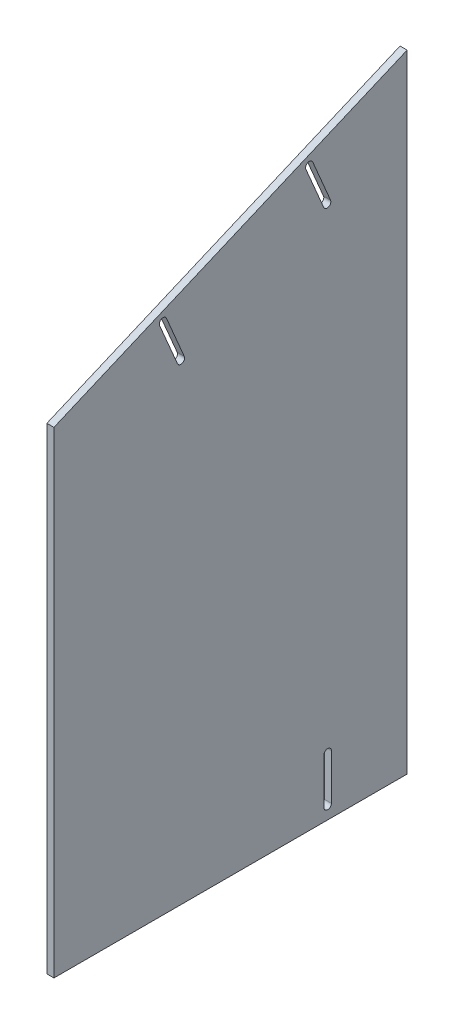
ISO-10303-21;
HEADER;
FILE_DESCRIPTION(('STEP AP214'),'2;1');
FILE_NAME('part.step','',(''),(''),'','','');
FILE_SCHEMA(('AUTOMOTIVE_DESIGN { 1 0 10303 214 1 1 1 1 }'));
ENDSEC;
DATA;
#1=APPLICATION_CONTEXT('core data for automotive mechanical design processes');
#2=APPLICATION_PROTOCOL_DEFINITION('international standard','automotive_design',2000,#1);
#3=PRODUCT_CONTEXT('',#1,'mechanical');
#4=PRODUCT('Part','Part','',(#3));
#5=PRODUCT_RELATED_PRODUCT_CATEGORY('part','',(#4));
#6=PRODUCT_DEFINITION_FORMATION('','',#4);
#7=PRODUCT_DEFINITION_CONTEXT('part definition',#1,'design');
#8=PRODUCT_DEFINITION('design','',#6,#7);
#9=PRODUCT_DEFINITION_SHAPE('','',#8);
#10=(LENGTH_UNIT() NAMED_UNIT(*) SI_UNIT(.MILLI.,.METRE.));
#11=(NAMED_UNIT(*) PLANE_ANGLE_UNIT() SI_UNIT($,.RADIAN.));
#12=(NAMED_UNIT(*) SI_UNIT($,.STERADIAN.) SOLID_ANGLE_UNIT());
#13=UNCERTAINTY_MEASURE_WITH_UNIT(LENGTH_MEASURE(1.E-05),#10,'distance_accuracy_value','');
#14=(GEOMETRIC_REPRESENTATION_CONTEXT(3) GLOBAL_UNCERTAINTY_ASSIGNED_CONTEXT((#13)) GLOBAL_UNIT_ASSIGNED_CONTEXT((#10,
#11,#12)) REPRESENTATION_CONTEXT('',''));
#15=CARTESIAN_POINT('',(0.,0.,0.));
#16=DIRECTION('',(0.,0.,1.));
#17=DIRECTION('',(1.,0.,0.));
#18=AXIS2_PLACEMENT_3D('',#15,#16,#17);
#19=CARTESIAN_POINT('',(4.,0.,0.));
#20=DIRECTION('',(1.,0.,0.));
#21=DIRECTION('',(0.,0.,-1.));
#22=AXIS2_PLACEMENT_3D('',#19,#20,#21);
#23=PLANE('',#22);
#24=DIRECTION('',(0.,-1.,0.));
#25=VECTOR('',#24,1.);
#26=CARTESIAN_POINT('',(4.,-355.,200.));
#27=LINE('',#26,#25);
#28=CARTESIAN_POINT('',(4.,-85.,200.));
#29=VERTEX_POINT('',#28);
#30=CARTESIAN_POINT('',(4.,-355.,200.));
#31=VERTEX_POINT('',#30);
#32=EDGE_CURVE('E250',#29,#31,#27,.T.);
#33=ORIENTED_EDGE('',*,*,#32,.T.);
#34=DIRECTION('',(0.,0.,-1.));
#35=VECTOR('',#34,1.);
#36=CARTESIAN_POINT('',(4.,-355.,0.));
#37=LINE('',#36,#35);
#38=CARTESIAN_POINT('',(4.,-355.,0.));
#39=VERTEX_POINT('',#38);
#40=EDGE_CURVE('E253',#31,#39,#37,.T.);
#41=ORIENTED_EDGE('',*,*,#40,.T.);
#42=DIRECTION('',(0.,1.,0.));
#43=VECTOR('',#42,1.);
#44=CARTESIAN_POINT('',(4.,0.,0.));
#45=LINE('',#44,#43);
#46=CARTESIAN_POINT('',(4.,0.,0.));
#47=VERTEX_POINT('',#46);
#48=EDGE_CURVE('E256',#39,#47,#45,.T.);
#49=ORIENTED_EDGE('',*,*,#48,.T.);
#50=DIRECTION('',(0.,-0.391140640344852,0.920330918458475));
#51=VECTOR('',#50,1.);
#52=CARTESIAN_POINT('',(4.,-85.,200.));
#53=LINE('',#52,#51);
#54=EDGE_CURVE('E258',#47,#29,#53,.T.);
#55=ORIENTED_EDGE('',*,*,#54,.T.);
#56=EDGE_LOOP('',(#33,#41,#49,#55));
#57=FACE_BOUND('',#56,.T.);
#58=DIRECTION('',(0.,-1.,0.));
#59=VECTOR('',#58,1.);
#60=CARTESIAN_POINT('',(4.,-322.1,47.0999999999999));
#61=LINE('',#60,#59);
#62=CARTESIAN_POINT('',(4.,-322.1,47.0999999999999));
#63=VERTEX_POINT('',#62);
#64=CARTESIAN_POINT('',(4.,-347.9,47.0999999999999));
#65=VERTEX_POINT('',#64);
#66=EDGE_CURVE('E221',#63,#65,#61,.T.);
#67=ORIENTED_EDGE('',*,*,#66,.F.);
#68=CARTESIAN_POINT('',(4.,-322.1,45.));
#69=DIRECTION('',(1.,0.,0.));
#70=DIRECTION('',(0.,0.,1.));
#71=AXIS2_PLACEMENT_3D('',#68,#69,#70);
#72=CIRCLE('',#71,2.09999999999999);
#73=CARTESIAN_POINT('',(4.,-322.1,42.9));
#74=VERTEX_POINT('',#73);
#75=EDGE_CURVE('E219',#74,#63,#72,.T.);
#76=ORIENTED_EDGE('',*,*,#75,.F.);
#77=DIRECTION('',(0.,1.,0.));
#78=VECTOR('',#77,1.);
#79=CARTESIAN_POINT('',(4.,-322.1,42.9));
#80=LINE('',#79,#78);
#81=CARTESIAN_POINT('',(4.,-347.9,42.9));
#82=VERTEX_POINT('',#81);
#83=EDGE_CURVE('E227',#82,#74,#80,.T.);
#84=ORIENTED_EDGE('',*,*,#83,.F.);
#85=CARTESIAN_POINT('',(4.,-347.9,45.));
#86=DIRECTION('',(1.,0.,0.));
#87=DIRECTION('',(0.,0.,1.));
#88=AXIS2_PLACEMENT_3D('',#85,#86,#87);
#89=CIRCLE('',#88,2.09999999999999);
#90=EDGE_CURVE('E224',#65,#82,#89,.T.);
#91=ORIENTED_EDGE('',*,*,#90,.F.);
#92=EDGE_LOOP('',(#67,#76,#84,#91));
#93=FACE_BOUND('',#92,.T.);
#94=DIRECTION('',(0.,-0.920330918458474,-0.391140640344852));
#95=VECTOR('',#94,1.);
#96=CARTESIAN_POINT('',(4.,-64.9989083146012,140.155482027238));
#97=LINE('',#96,#95);
#98=CARTESIAN_POINT('',(4.,-64.9989083146012,140.155482027238));
#99=VERTEX_POINT('',#98);
#100=CARTESIAN_POINT('',(4.,-88.7434460108303,130.06405350634));
#101=VERTEX_POINT('',#100);
#102=EDGE_CURVE('E190',#99,#101,#97,.T.);
#103=ORIENTED_EDGE('',*,*,#102,.F.);
#104=CARTESIAN_POINT('',(4.,-64.177512969877,138.222787098475));
#105=DIRECTION('',(1.,0.,0.));
#106=DIRECTION('',(0.,0.,1.));
#107=AXIS2_PLACEMENT_3D('',#104,#105,#106);
#108=CIRCLE('',#107,2.10000000000004);
#109=CARTESIAN_POINT('',(4.,-63.3561176251528,136.290092169712));
#110=VERTEX_POINT('',#109);
#111=EDGE_CURVE('E188',#110,#99,#108,.T.);
#112=ORIENTED_EDGE('',*,*,#111,.F.);
#113=DIRECTION('',(0.,0.920330918458475,0.391140640344851));
#114=VECTOR('',#113,1.);
#115=CARTESIAN_POINT('',(4.,-63.3561176251528,136.290092169712));
#116=LINE('',#115,#114);
#117=CARTESIAN_POINT('',(4.,-87.1006553213819,126.198663648815));
#118=VERTEX_POINT('',#117);
#119=EDGE_CURVE('E196',#118,#110,#116,.T.);
#120=ORIENTED_EDGE('',*,*,#119,.F.);
#121=CARTESIAN_POINT('',(4.,-87.9220506661061,128.131358577577));
#122=DIRECTION('',(1.,0.,0.));
#123=DIRECTION('',(0.,0.,1.));
#124=AXIS2_PLACEMENT_3D('',#121,#122,#123);
#125=CIRCLE('',#124,2.10000000000002);
#126=EDGE_CURVE('E193',#101,#118,#125,.T.);
#127=ORIENTED_EDGE('',*,*,#126,.F.);
#128=EDGE_LOOP('',(#103,#112,#120,#127));
#129=FACE_BOUND('',#128,.T.);
#130=DIRECTION('',(0.,-0.920330918458474,-0.391140640344852));
#131=VECTOR('',#130,1.);
#132=CARTESIAN_POINT('',(4.,-29.7962506835645,57.325699365975));
#133=LINE('',#132,#131);
#134=CARTESIAN_POINT('',(4.,-29.7962506835645,57.325699365975));
#135=VERTEX_POINT('',#134);
#136=CARTESIAN_POINT('',(4.,-53.5407883797936,47.2342708450776));
#137=VERTEX_POINT('',#136);
#138=EDGE_CURVE('E160',#135,#137,#133,.T.);
#139=ORIENTED_EDGE('',*,*,#138,.F.);
#140=CARTESIAN_POINT('',(4.,-28.9748553388403,55.3930044372121));
#141=DIRECTION('',(1.,0.,0.));
#142=DIRECTION('',(0.,0.,-1.));
#143=AXIS2_PLACEMENT_3D('',#140,#141,#142);
#144=CIRCLE('',#143,2.10000000000003);
#145=CARTESIAN_POINT('',(4.,-28.1534599941161,53.4603095084493));
#146=VERTEX_POINT('',#145);
#147=EDGE_CURVE('E152',#146,#135,#144,.T.);
#148=ORIENTED_EDGE('',*,*,#147,.F.);
#149=DIRECTION('',(0.,0.920330918458475,0.391140640344851));
#150=VECTOR('',#149,1.);
#151=CARTESIAN_POINT('',(4.,-28.1534599941161,53.4603095084493));
#152=LINE('',#151,#150);
#153=CARTESIAN_POINT('',(4.,-51.8979976903452,43.368880987552));
#154=VERTEX_POINT('',#153);
#155=EDGE_CURVE('E174',#154,#146,#152,.T.);
#156=ORIENTED_EDGE('',*,*,#155,.F.);
#157=CARTESIAN_POINT('',(4.,-52.7193930350694,45.3015759163148));
#158=DIRECTION('',(1.,0.,0.));
#159=DIRECTION('',(0.,0.,-1.));
#160=AXIS2_PLACEMENT_3D('',#157,#158,#159);
#161=CIRCLE('',#160,2.10000000000002);
#162=EDGE_CURVE('E172',#137,#154,#161,.T.);
#163=ORIENTED_EDGE('',*,*,#162,.F.);
#164=EDGE_LOOP('',(#139,#148,#156,#163));
#165=FACE_BOUND('',#164,.T.);
#166=ADVANCED_FACE('F39',(#57,#93,#129,#165),#23,.T.);
#167=CARTESIAN_POINT('',(0.,0.,0.));
#168=DIRECTION('',(1.,0.,0.));
#169=DIRECTION('',(0.,0.,-1.));
#170=AXIS2_PLACEMENT_3D('',#167,#168,#169);
#171=PLANE('',#170);
#172=CARTESIAN_POINT('',(0.,-64.177512969877,138.222787098475));
#173=DIRECTION('',(1.,0.,0.));
#174=DIRECTION('',(0.,0.,1.));
#175=AXIS2_PLACEMENT_3D('',#172,#173,#174);
#176=CIRCLE('',#175,2.10000000000004);
#177=CARTESIAN_POINT('',(0.,-63.3561176251528,136.290092169712));
#178=VERTEX_POINT('',#177);
#179=CARTESIAN_POINT('',(0.,-64.9989083146012,140.155482027238));
#180=VERTEX_POINT('',#179);
#181=EDGE_CURVE('E168',#178,#180,#176,.T.);
#182=ORIENTED_EDGE('',*,*,#181,.T.);
#183=DIRECTION('',(0.,-0.920330918458474,-0.391140640344852));
#184=VECTOR('',#183,1.);
#185=CARTESIAN_POINT('',(0.,-64.9989083146012,140.155482027238));
#186=LINE('',#185,#184);
#187=CARTESIAN_POINT('',(0.,-88.7434460108303,130.06405350634));
#188=VERTEX_POINT('',#187);
#189=EDGE_CURVE('E201',#180,#188,#186,.T.);
#190=ORIENTED_EDGE('',*,*,#189,.T.);
#191=CARTESIAN_POINT('',(0.,-87.9220506661061,128.131358577577));
#192=DIRECTION('',(1.,0.,0.));
#193=DIRECTION('',(0.,0.,1.));
#194=AXIS2_PLACEMENT_3D('',#191,#192,#193);
#195=CIRCLE('',#194,2.10000000000002);
#196=CARTESIAN_POINT('',(0.,-87.1006553213819,126.198663648815));
#197=VERTEX_POINT('',#196);
#198=EDGE_CURVE('E204',#188,#197,#195,.T.);
#199=ORIENTED_EDGE('',*,*,#198,.T.);
#200=DIRECTION('',(0.,0.920330918458475,0.391140640344851));
#201=VECTOR('',#200,1.);
#202=CARTESIAN_POINT('',(0.,-63.3561176251528,136.290092169712));
#203=LINE('',#202,#201);
#204=EDGE_CURVE('E191',#197,#178,#203,.T.);
#205=ORIENTED_EDGE('',*,*,#204,.T.);
#206=EDGE_LOOP('',(#182,#190,#199,#205));
#207=FACE_BOUND('',#206,.T.);
#208=DIRECTION('',(0.,-1.,0.));
#209=VECTOR('',#208,1.);
#210=CARTESIAN_POINT('',(0.,-355.,200.));
#211=LINE('',#210,#209);
#212=CARTESIAN_POINT('',(0.,-85.,200.));
#213=VERTEX_POINT('',#212);
#214=CARTESIAN_POINT('',(0.,-355.,200.));
#215=VERTEX_POINT('',#214);
#216=EDGE_CURVE('E249',#213,#215,#211,.T.);
#217=ORIENTED_EDGE('',*,*,#216,.F.);
#218=DIRECTION('',(0.,-0.391140640344852,0.920330918458475));
#219=VECTOR('',#218,1.);
#220=CARTESIAN_POINT('',(0.,-85.,200.));
#221=LINE('',#220,#219);
#222=CARTESIAN_POINT('',(0.,0.,0.));
#223=VERTEX_POINT('',#222);
#224=EDGE_CURVE('E254',#223,#213,#221,.T.);
#225=ORIENTED_EDGE('',*,*,#224,.F.);
#226=DIRECTION('',(0.,1.,0.));
#227=VECTOR('',#226,1.);
#228=CARTESIAN_POINT('',(0.,0.,0.));
#229=LINE('',#228,#227);
#230=CARTESIAN_POINT('',(0.,-355.,0.));
#231=VERTEX_POINT('',#230);
#232=EDGE_CURVE('E265',#231,#223,#229,.T.);
#233=ORIENTED_EDGE('',*,*,#232,.F.);
#234=DIRECTION('',(0.,0.,-1.));
#235=VECTOR('',#234,1.);
#236=CARTESIAN_POINT('',(0.,-355.,0.));
#237=LINE('',#236,#235);
#238=EDGE_CURVE('E263',#215,#231,#237,.T.);
#239=ORIENTED_EDGE('',*,*,#238,.F.);
#240=EDGE_LOOP('',(#217,#225,#233,#239));
#241=FACE_BOUND('',#240,.T.);
#242=CARTESIAN_POINT('',(0.,-322.1,45.));
#243=DIRECTION('',(1.,0.,0.));
#244=DIRECTION('',(0.,0.,1.));
#245=AXIS2_PLACEMENT_3D('',#242,#243,#244);
#246=CIRCLE('',#245,2.09999999999999);
#247=CARTESIAN_POINT('',(0.,-322.1,42.9));
#248=VERTEX_POINT('',#247);
#249=CARTESIAN_POINT('',(0.,-322.1,47.0999999999999));
#250=VERTEX_POINT('',#249);
#251=EDGE_CURVE('E218',#248,#250,#246,.T.);
#252=ORIENTED_EDGE('',*,*,#251,.T.);
#253=DIRECTION('',(0.,-1.,0.));
#254=VECTOR('',#253,1.);
#255=CARTESIAN_POINT('',(0.,-322.1,47.0999999999999));
#256=LINE('',#255,#254);
#257=CARTESIAN_POINT('',(0.,-347.9,47.0999999999999));
#258=VERTEX_POINT('',#257);
#259=EDGE_CURVE('E232',#250,#258,#256,.T.);
#260=ORIENTED_EDGE('',*,*,#259,.T.);
#261=CARTESIAN_POINT('',(0.,-347.9,45.));
#262=DIRECTION('',(1.,0.,0.));
#263=DIRECTION('',(0.,0.,1.));
#264=AXIS2_PLACEMENT_3D('',#261,#262,#263);
#265=CIRCLE('',#264,2.09999999999999);
#266=CARTESIAN_POINT('',(0.,-347.9,42.8999999999999));
#267=VERTEX_POINT('',#266);
#268=EDGE_CURVE('E235',#258,#267,#265,.T.);
#269=ORIENTED_EDGE('',*,*,#268,.T.);
#270=DIRECTION('',(0.,1.,0.));
#271=VECTOR('',#270,1.);
#272=CARTESIAN_POINT('',(0.,-322.1,42.9));
#273=LINE('',#272,#271);
#274=EDGE_CURVE('E222',#267,#248,#273,.T.);
#275=ORIENTED_EDGE('',*,*,#274,.T.);
#276=EDGE_LOOP('',(#252,#260,#269,#275));
#277=FACE_BOUND('',#276,.T.);
#278=CARTESIAN_POINT('',(0.,-28.9748553388403,55.3930044372121));
#279=DIRECTION('',(1.,0.,0.));
#280=DIRECTION('',(0.,0.,-1.));
#281=AXIS2_PLACEMENT_3D('',#278,#279,#280);
#282=CIRCLE('',#281,2.10000000000003);
#283=CARTESIAN_POINT('',(0.,-28.1534599941161,53.4603095084493));
#284=VERTEX_POINT('',#283);
#285=CARTESIAN_POINT('',(0.,-29.7962506835645,57.325699365975));
#286=VERTEX_POINT('',#285);
#287=EDGE_CURVE('E62',#284,#286,#282,.T.);
#288=ORIENTED_EDGE('',*,*,#287,.T.);
#289=DIRECTION('',(0.,-0.920330918458474,-0.391140640344852));
#290=VECTOR('',#289,1.);
#291=CARTESIAN_POINT('',(0.,-29.7962506835645,57.325699365975));
#292=LINE('',#291,#290);
#293=CARTESIAN_POINT('',(0.,-53.5407883797936,47.2342708450776));
#294=VERTEX_POINT('',#293);
#295=EDGE_CURVE('E167',#286,#294,#292,.T.);
#296=ORIENTED_EDGE('',*,*,#295,.T.);
#297=CARTESIAN_POINT('',(0.,-52.7193930350694,45.3015759163148));
#298=DIRECTION('',(1.,0.,0.));
#299=DIRECTION('',(0.,0.,-1.));
#300=AXIS2_PLACEMENT_3D('',#297,#298,#299);
#301=CIRCLE('',#300,2.10000000000002);
#302=CARTESIAN_POINT('',(0.,-51.8979976903452,43.368880987552));
#303=VERTEX_POINT('',#302);
#304=EDGE_CURVE('E180',#294,#303,#301,.T.);
#305=ORIENTED_EDGE('',*,*,#304,.T.);
#306=DIRECTION('',(0.,0.920330918458475,0.391140640344851));
#307=VECTOR('',#306,1.);
#308=CARTESIAN_POINT('',(0.,-28.1534599941161,53.4603095084493));
#309=LINE('',#308,#307);
#310=EDGE_CURVE('E161',#303,#284,#309,.T.);
#311=ORIENTED_EDGE('',*,*,#310,.T.);
#312=EDGE_LOOP('',(#288,#296,#305,#311));
#313=FACE_BOUND('',#312,.T.);
#314=ADVANCED_FACE('F283',(#207,#241,#277,#313),#171,.F.);
#315=CARTESIAN_POINT('',(4.,-355.,200.));
#316=DIRECTION('',(0.,0.,-1.));
#317=DIRECTION('',(0.,1.,0.));
#318=AXIS2_PLACEMENT_3D('',#315,#316,#317);
#319=PLANE('',#318);
#320=ORIENTED_EDGE('',*,*,#216,.T.);
#321=DIRECTION('',(-1.,0.,0.));
#322=VECTOR('',#321,1.);
#323=CARTESIAN_POINT('',(4.,-355.,200.));
#324=LINE('',#323,#322);
#325=EDGE_CURVE('E11',#31,#215,#324,.T.);
#326=ORIENTED_EDGE('',*,*,#325,.F.);
#327=ORIENTED_EDGE('',*,*,#32,.F.);
#328=DIRECTION('',(-1.,0.,0.));
#329=VECTOR('',#328,1.);
#330=CARTESIAN_POINT('',(4.,-85.,200.));
#331=LINE('',#330,#329);
#332=EDGE_CURVE('E260',#29,#213,#331,.T.);
#333=ORIENTED_EDGE('',*,*,#332,.T.);
#334=EDGE_LOOP('',(#320,#326,#327,#333));
#335=FACE_BOUND('',#334,.T.);
#336=ADVANCED_FACE('F41',(#335),#319,.F.);
#337=CARTESIAN_POINT('',(4.,-355.,0.));
#338=DIRECTION('',(0.,1.,0.));
#339=DIRECTION('',(0.,0.,1.));
#340=AXIS2_PLACEMENT_3D('',#337,#338,#339);
#341=PLANE('',#340);
#342=ORIENTED_EDGE('',*,*,#238,.T.);
#343=DIRECTION('',(-1.,0.,0.));
#344=VECTOR('',#343,1.);
#345=CARTESIAN_POINT('',(4.,-355.,0.));
#346=LINE('',#345,#344);
#347=EDGE_CURVE('E47',#39,#231,#346,.T.);
#348=ORIENTED_EDGE('',*,*,#347,.F.);
#349=ORIENTED_EDGE('',*,*,#40,.F.);
#350=ORIENTED_EDGE('',*,*,#325,.T.);
#351=EDGE_LOOP('',(#342,#348,#349,#350));
#352=FACE_BOUND('',#351,.T.);
#353=ADVANCED_FACE('F294',(#352),#341,.F.);
#354=CARTESIAN_POINT('',(4.,0.,0.));
#355=DIRECTION('',(0.,0.,1.));
#356=DIRECTION('',(0.,-1.,0.));
#357=AXIS2_PLACEMENT_3D('',#354,#355,#356);
#358=PLANE('',#357);
#359=ORIENTED_EDGE('',*,*,#232,.T.);
#360=DIRECTION('',(-1.,0.,0.));
#361=VECTOR('',#360,1.);
#362=CARTESIAN_POINT('',(4.,0.,0.));
#363=LINE('',#362,#361);
#364=EDGE_CURVE('E270',#47,#223,#363,.T.);
#365=ORIENTED_EDGE('',*,*,#364,.F.);
#366=ORIENTED_EDGE('',*,*,#48,.F.);
#367=ORIENTED_EDGE('',*,*,#347,.T.);
#368=EDGE_LOOP('',(#359,#365,#366,#367));
#369=FACE_BOUND('',#368,.T.);
#370=ADVANCED_FACE('F277',(#369),#358,.F.);
#371=CARTESIAN_POINT('',(4.,-85.,200.));
#372=DIRECTION('',(0.,-0.920330918458475,-0.391140640344852));
#373=DIRECTION('',(0.,0.391140640344852,-0.920330918458475));
#374=AXIS2_PLACEMENT_3D('',#371,#372,#373);
#375=PLANE('',#374);
#376=ORIENTED_EDGE('',*,*,#224,.T.);
#377=ORIENTED_EDGE('',*,*,#332,.F.);
#378=ORIENTED_EDGE('',*,*,#54,.F.);
#379=ORIENTED_EDGE('',*,*,#364,.T.);
#380=EDGE_LOOP('',(#376,#377,#378,#379));
#381=FACE_BOUND('',#380,.T.);
#382=ADVANCED_FACE('F287',(#381),#375,.F.);
#383=CARTESIAN_POINT('',(4.,-322.1,45.));
#384=DIRECTION('',(-1.,0.,0.));
#385=DIRECTION('',(0.,0.,1.));
#386=AXIS2_PLACEMENT_3D('',#383,#384,#385);
#387=CYLINDRICAL_SURFACE('',#386,2.09999999999999);
#388=ORIENTED_EDGE('',*,*,#251,.F.);
#389=DIRECTION('',(-1.,0.,0.));
#390=VECTOR('',#389,1.);
#391=CARTESIAN_POINT('',(4.,-322.1,42.9));
#392=LINE('',#391,#390);
#393=EDGE_CURVE('E229',#74,#248,#392,.T.);
#394=ORIENTED_EDGE('',*,*,#393,.F.);
#395=ORIENTED_EDGE('',*,*,#75,.T.);
#396=DIRECTION('',(-1.,0.,0.));
#397=VECTOR('',#396,1.);
#398=CARTESIAN_POINT('',(4.,-322.1,47.0999999999999));
#399=LINE('',#398,#397);
#400=EDGE_CURVE('E246',#63,#250,#399,.T.);
#401=ORIENTED_EDGE('',*,*,#400,.T.);
#402=EDGE_LOOP('',(#388,#394,#395,#401));
#403=FACE_BOUND('',#402,.T.);
#404=ADVANCED_FACE('F309',(#403),#387,.F.);
#405=CARTESIAN_POINT('',(4.,-322.1,47.0999999999999));
#406=DIRECTION('',(0.,0.,-1.));
#407=DIRECTION('',(-1.,0.,0.));
#408=AXIS2_PLACEMENT_3D('',#405,#406,#407);
#409=PLANE('',#408);
#410=ORIENTED_EDGE('',*,*,#259,.F.);
#411=ORIENTED_EDGE('',*,*,#400,.F.);
#412=ORIENTED_EDGE('',*,*,#66,.T.);
#413=DIRECTION('',(-1.,0.,0.));
#414=VECTOR('',#413,1.);
#415=CARTESIAN_POINT('',(4.,-347.9,47.0999999999999));
#416=LINE('',#415,#414);
#417=EDGE_CURVE('E244',#65,#258,#416,.T.);
#418=ORIENTED_EDGE('',*,*,#417,.T.);
#419=EDGE_LOOP('',(#410,#411,#412,#418));
#420=FACE_BOUND('',#419,.T.);
#421=ADVANCED_FACE('F316',(#420),#409,.T.);
#422=CARTESIAN_POINT('',(4.,-347.9,45.));
#423=DIRECTION('',(-1.,0.,0.));
#424=DIRECTION('',(0.,0.,1.));
#425=AXIS2_PLACEMENT_3D('',#422,#423,#424);
#426=CYLINDRICAL_SURFACE('',#425,2.09999999999999);
#427=ORIENTED_EDGE('',*,*,#268,.F.);
#428=ORIENTED_EDGE('',*,*,#417,.F.);
#429=ORIENTED_EDGE('',*,*,#90,.T.);
#430=DIRECTION('',(-1.,0.,0.));
#431=VECTOR('',#430,1.);
#432=CARTESIAN_POINT('',(4.,-347.9,42.8999999999999));
#433=LINE('',#432,#431);
#434=EDGE_CURVE('E242',#82,#267,#433,.T.);
#435=ORIENTED_EDGE('',*,*,#434,.T.);
#436=EDGE_LOOP('',(#427,#428,#429,#435));
#437=FACE_BOUND('',#436,.T.);
#438=ADVANCED_FACE('F321',(#437),#426,.F.);
#439=CARTESIAN_POINT('',(4.,-322.1,42.9));
#440=DIRECTION('',(0.,0.,1.));
#441=DIRECTION('',(0.,-1.,0.));
#442=AXIS2_PLACEMENT_3D('',#439,#440,#441);
#443=PLANE('',#442);
#444=ORIENTED_EDGE('',*,*,#274,.F.);
#445=ORIENTED_EDGE('',*,*,#434,.F.);
#446=ORIENTED_EDGE('',*,*,#83,.T.);
#447=ORIENTED_EDGE('',*,*,#393,.T.);
#448=EDGE_LOOP('',(#444,#445,#446,#447));
#449=FACE_BOUND('',#448,.T.);
#450=ADVANCED_FACE('F328',(#449),#443,.T.);
#451=CARTESIAN_POINT('',(4.,-64.177512969877,138.222787098475));
#452=DIRECTION('',(-1.,0.,0.));
#453=DIRECTION('',(0.,0.,1.));
#454=AXIS2_PLACEMENT_3D('',#451,#452,#453);
#455=CYLINDRICAL_SURFACE('',#454,2.10000000000004);
#456=ORIENTED_EDGE('',*,*,#181,.F.);
#457=DIRECTION('',(-1.,0.,0.));
#458=VECTOR('',#457,1.);
#459=CARTESIAN_POINT('',(4.,-63.3561176251528,136.290092169712));
#460=LINE('',#459,#458);
#461=EDGE_CURVE('E198',#110,#178,#460,.T.);
#462=ORIENTED_EDGE('',*,*,#461,.F.);
#463=ORIENTED_EDGE('',*,*,#111,.T.);
#464=DIRECTION('',(-1.,0.,0.));
#465=VECTOR('',#464,1.);
#466=CARTESIAN_POINT('',(4.,-64.9989083146012,140.155482027238));
#467=LINE('',#466,#465);
#468=EDGE_CURVE('E215',#99,#180,#467,.T.);
#469=ORIENTED_EDGE('',*,*,#468,.T.);
#470=EDGE_LOOP('',(#456,#462,#463,#469));
#471=FACE_BOUND('',#470,.T.);
#472=ADVANCED_FACE('F350',(#471),#455,.F.);
#473=CARTESIAN_POINT('',(4.,-64.9989083146012,140.155482027238));
#474=DIRECTION('',(0.,0.391140640344852,-0.920330918458475));
#475=DIRECTION('',(0.,0.920330918458475,0.391140640344852));
#476=AXIS2_PLACEMENT_3D('',#473,#474,#475);
#477=PLANE('',#476);
#478=ORIENTED_EDGE('',*,*,#189,.F.);
#479=ORIENTED_EDGE('',*,*,#468,.F.);
#480=ORIENTED_EDGE('',*,*,#102,.T.);
#481=DIRECTION('',(-1.,0.,0.));
#482=VECTOR('',#481,1.);
#483=CARTESIAN_POINT('',(4.,-88.7434460108303,130.06405350634));
#484=LINE('',#483,#482);
#485=EDGE_CURVE('E213',#101,#188,#484,.T.);
#486=ORIENTED_EDGE('',*,*,#485,.T.);
#487=EDGE_LOOP('',(#478,#479,#480,#486));
#488=FACE_BOUND('',#487,.T.);
#489=ADVANCED_FACE('F344',(#488),#477,.T.);
#490=CARTESIAN_POINT('',(4.,-87.9220506661061,128.131358577577));
#491=DIRECTION('',(-1.,0.,0.));
#492=DIRECTION('',(0.,0.,1.));
#493=AXIS2_PLACEMENT_3D('',#490,#491,#492);
#494=CYLINDRICAL_SURFACE('',#493,2.10000000000002);
#495=ORIENTED_EDGE('',*,*,#198,.F.);
#496=ORIENTED_EDGE('',*,*,#485,.F.);
#497=ORIENTED_EDGE('',*,*,#126,.T.);
#498=DIRECTION('',(-1.,0.,0.));
#499=VECTOR('',#498,1.);
#500=CARTESIAN_POINT('',(4.,-87.1006553213819,126.198663648815));
#501=LINE('',#500,#499);
#502=EDGE_CURVE('E211',#118,#197,#501,.T.);
#503=ORIENTED_EDGE('',*,*,#502,.T.);
#504=EDGE_LOOP('',(#495,#496,#497,#503));
#505=FACE_BOUND('',#504,.T.);
#506=ADVANCED_FACE('F347',(#505),#494,.F.);
#507=CARTESIAN_POINT('',(4.,-63.3561176251528,136.290092169712));
#508=DIRECTION('',(0.,-0.391140640344851,0.920330918458475));
#509=DIRECTION('',(0.,-0.920330918458475,-0.391140640344851));
#510=AXIS2_PLACEMENT_3D('',#507,#508,#509);
#511=PLANE('',#510);
#512=ORIENTED_EDGE('',*,*,#204,.F.);
#513=ORIENTED_EDGE('',*,*,#502,.F.);
#514=ORIENTED_EDGE('',*,*,#119,.T.);
#515=ORIENTED_EDGE('',*,*,#461,.T.);
#516=EDGE_LOOP('',(#512,#513,#514,#515));
#517=FACE_BOUND('',#516,.T.);
#518=ADVANCED_FACE('F353',(#517),#511,.T.);
#519=CARTESIAN_POINT('',(4.,-28.9748553388403,55.3930044372121));
#520=DIRECTION('',(-1.,0.,0.));
#521=DIRECTION('',(0.,0.,1.));
#522=AXIS2_PLACEMENT_3D('',#519,#520,#521);
#523=CYLINDRICAL_SURFACE('',#522,2.10000000000003);
#524=ORIENTED_EDGE('',*,*,#287,.F.);
#525=DIRECTION('',(-1.,0.,0.));
#526=VECTOR('',#525,1.);
#527=CARTESIAN_POINT('',(4.,-28.1534599941161,53.4603095084493));
#528=LINE('',#527,#526);
#529=EDGE_CURVE('E156',#146,#284,#528,.T.);
#530=ORIENTED_EDGE('',*,*,#529,.F.);
#531=ORIENTED_EDGE('',*,*,#147,.T.);
#532=DIRECTION('',(-1.,0.,0.));
#533=VECTOR('',#532,1.);
#534=CARTESIAN_POINT('',(4.,-29.7962506835645,57.325699365975));
#535=LINE('',#534,#533);
#536=EDGE_CURVE('E155',#135,#286,#535,.T.);
#537=ORIENTED_EDGE('',*,*,#536,.T.);
#538=EDGE_LOOP('',(#524,#530,#531,#537));
#539=FACE_BOUND('',#538,.T.);
#540=ADVANCED_FACE('F154',(#539),#523,.F.);
#541=CARTESIAN_POINT('',(4.,-29.7962506835645,57.325699365975));
#542=DIRECTION('',(0.,0.391140640344852,-0.920330918458475));
#543=DIRECTION('',(0.,0.920330918458475,0.391140640344852));
#544=AXIS2_PLACEMENT_3D('',#541,#542,#543);
#545=PLANE('',#544);
#546=ORIENTED_EDGE('',*,*,#295,.F.);
#547=ORIENTED_EDGE('',*,*,#536,.F.);
#548=ORIENTED_EDGE('',*,*,#138,.T.);
#549=DIRECTION('',(-1.,0.,0.));
#550=VECTOR('',#549,1.);
#551=CARTESIAN_POINT('',(4.,-53.5407883797936,47.2342708450776));
#552=LINE('',#551,#550);
#553=EDGE_CURVE('E169',#137,#294,#552,.T.);
#554=ORIENTED_EDGE('',*,*,#553,.T.);
#555=EDGE_LOOP('',(#546,#547,#548,#554));
#556=FACE_BOUND('',#555,.T.);
#557=ADVANCED_FACE('F164',(#556),#545,.T.);
#558=CARTESIAN_POINT('',(4.,-52.7193930350694,45.3015759163148));
#559=DIRECTION('',(-1.,0.,0.));
#560=DIRECTION('',(0.,0.,1.));
#561=AXIS2_PLACEMENT_3D('',#558,#559,#560);
#562=CYLINDRICAL_SURFACE('',#561,2.10000000000002);
#563=ORIENTED_EDGE('',*,*,#304,.F.);
#564=ORIENTED_EDGE('',*,*,#553,.F.);
#565=ORIENTED_EDGE('',*,*,#162,.T.);
#566=DIRECTION('',(-1.,0.,0.));
#567=VECTOR('',#566,1.);
#568=CARTESIAN_POINT('',(4.,-51.8979976903452,43.368880987552));
#569=LINE('',#568,#567);
#570=EDGE_CURVE('E54',#154,#303,#569,.T.);
#571=ORIENTED_EDGE('',*,*,#570,.T.);
#572=EDGE_LOOP('',(#563,#564,#565,#571));
#573=FACE_BOUND('',#572,.T.);
#574=ADVANCED_FACE('F415',(#573),#562,.F.);
#575=CARTESIAN_POINT('',(4.,-28.1534599941161,53.4603095084493));
#576=DIRECTION('',(0.,-0.391140640344851,0.920330918458475));
#577=DIRECTION('',(0.,-0.920330918458475,-0.391140640344851));
#578=AXIS2_PLACEMENT_3D('',#575,#576,#577);
#579=PLANE('',#578);
#580=ORIENTED_EDGE('',*,*,#310,.F.);
#581=ORIENTED_EDGE('',*,*,#570,.F.);
#582=ORIENTED_EDGE('',*,*,#155,.T.);
#583=ORIENTED_EDGE('',*,*,#529,.T.);
#584=EDGE_LOOP('',(#580,#581,#582,#583));
#585=FACE_BOUND('',#584,.T.);
#586=ADVANCED_FACE('F423',(#585),#579,.T.);
#587=CLOSED_SHELL('',(#166,#314,#336,#353,#370,#382,#404,#421,#438,#450,#472,#489,#506,#518,
#540,#557,#574,#586));
#588=MANIFOLD_SOLID_BREP('B2',#587);
#589=ADVANCED_BREP_SHAPE_REPRESENTATION('',(#18,#588),#14);
#590=SHAPE_DEFINITION_REPRESENTATION(#9,#589);
ENDSEC;
END-ISO-10303-21;
